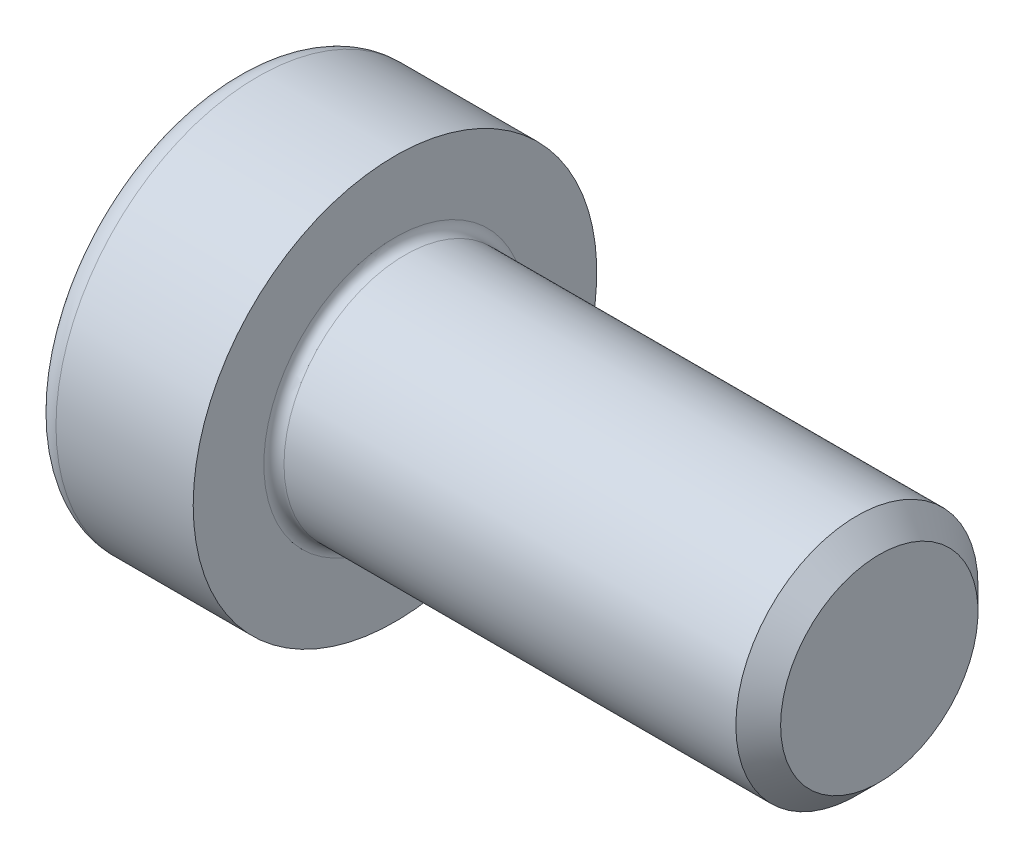
ISO-10303-21;
HEADER;
FILE_DESCRIPTION(('STEP AP214'),'2;1');
FILE_NAME('part.step','',(''),(''),'','','');
FILE_SCHEMA(('AUTOMOTIVE_DESIGN { 1 0 10303 214 1 1 1 1 }'));
ENDSEC;
DATA;
#1=APPLICATION_CONTEXT('core data for automotive mechanical design processes');
#2=APPLICATION_PROTOCOL_DEFINITION('international standard','automotive_design',2000,#1);
#3=PRODUCT_CONTEXT('',#1,'mechanical');
#4=PRODUCT('Part','Part','',(#3));
#5=PRODUCT_RELATED_PRODUCT_CATEGORY('part','',(#4));
#6=PRODUCT_DEFINITION_FORMATION('','',#4);
#7=PRODUCT_DEFINITION_CONTEXT('part definition',#1,'design');
#8=PRODUCT_DEFINITION('design','',#6,#7);
#9=PRODUCT_DEFINITION_SHAPE('','',#8);
#10=(LENGTH_UNIT() NAMED_UNIT(*) SI_UNIT(.MILLI.,.METRE.));
#11=(NAMED_UNIT(*) PLANE_ANGLE_UNIT() SI_UNIT($,.RADIAN.));
#12=(NAMED_UNIT(*) SI_UNIT($,.STERADIAN.) SOLID_ANGLE_UNIT());
#13=UNCERTAINTY_MEASURE_WITH_UNIT(LENGTH_MEASURE(1.E-05),#10,'distance_accuracy_value','');
#14=(GEOMETRIC_REPRESENTATION_CONTEXT(3) GLOBAL_UNCERTAINTY_ASSIGNED_CONTEXT((#13)) GLOBAL_UNIT_ASSIGNED_CONTEXT((#10,
#11,#12)) REPRESENTATION_CONTEXT('',''));
#15=CARTESIAN_POINT('',(0.,0.,0.));
#16=DIRECTION('',(0.,0.,1.));
#17=DIRECTION('',(1.,0.,0.));
#18=AXIS2_PLACEMENT_3D('',#15,#16,#17);
#19=CARTESIAN_POINT('',(0.,0.,0.));
#20=DIRECTION('',(-1.,0.,0.));
#21=DIRECTION('',(0.,0.,1.));
#22=AXIS2_PLACEMENT_3D('',#19,#20,#21);
#23=PLANE('',#22);
#24=DIRECTION('',(0.,-0.499999999999998,0.86602540378444));
#25=VECTOR('',#24,1.);
#26=CARTESIAN_POINT('',(0.,2.30940107675851,0.));
#27=LINE('',#26,#25);
#28=CARTESIAN_POINT('',(0.,2.30940107675851,0.));
#29=VERTEX_POINT('',#28);
#30=CARTESIAN_POINT('',(0.,1.15470053837926,1.99999999999999));
#31=VERTEX_POINT('',#30);
#32=EDGE_CURVE('E266',#29,#31,#27,.T.);
#33=ORIENTED_EDGE('',*,*,#32,.T.);
#34=DIRECTION('',(0.,1.,0.));
#35=VECTOR('',#34,1.);
#36=CARTESIAN_POINT('',(0.,-1.15470053837924,2.));
#37=LINE('',#36,#35);
#38=CARTESIAN_POINT('',(0.,-1.15470053837924,2.));
#39=VERTEX_POINT('',#38);
#40=EDGE_CURVE('E138',#39,#31,#37,.T.);
#41=ORIENTED_EDGE('',*,*,#40,.F.);
#42=DIRECTION('',(0.,-0.500000000000001,-0.866025403784438));
#43=VECTOR('',#42,1.);
#44=CARTESIAN_POINT('',(0.,-1.15470053837924,2.));
#45=LINE('',#44,#43);
#46=CARTESIAN_POINT('',(0.,-2.30940107675849,0.));
#47=VERTEX_POINT('',#46);
#48=EDGE_CURVE('E269',#39,#47,#45,.T.);
#49=ORIENTED_EDGE('',*,*,#48,.T.);
#50=DIRECTION('',(0.,0.499999999999997,-0.86602540378444));
#51=VECTOR('',#50,1.);
#52=CARTESIAN_POINT('',(0.,-2.30940107675849,0.));
#53=LINE('',#52,#51);
#54=CARTESIAN_POINT('',(0.,-1.15470053837925,-2.));
#55=VERTEX_POINT('',#54);
#56=EDGE_CURVE('E272',#47,#55,#53,.T.);
#57=ORIENTED_EDGE('',*,*,#56,.T.);
#58=DIRECTION('',(0.,-1.,0.));
#59=VECTOR('',#58,1.);
#60=CARTESIAN_POINT('',(0.,1.15470053837925,-2.00000000000001));
#61=LINE('',#60,#59);
#62=CARTESIAN_POINT('',(0.,1.15470053837925,-2.00000000000001));
#63=VERTEX_POINT('',#62);
#64=EDGE_CURVE('E275',#63,#55,#61,.T.);
#65=ORIENTED_EDGE('',*,*,#64,.F.);
#66=DIRECTION('',(0.,-0.500000000000001,-0.866025403784438));
#67=VECTOR('',#66,1.);
#68=CARTESIAN_POINT('',(0.,2.30940107675851,0.));
#69=LINE('',#68,#67);
#70=EDGE_CURVE('E133',#29,#63,#69,.T.);
#71=ORIENTED_EDGE('',*,*,#70,.F.);
#72=EDGE_LOOP('',(#33,#41,#49,#57,#65,#71));
#73=FACE_BOUND('',#72,.T.);
#74=CARTESIAN_POINT('',(0.,0.,0.));
#75=DIRECTION('',(-1.,0.,0.));
#76=DIRECTION('',(0.,0.,1.));
#77=AXIS2_PLACEMENT_3D('',#74,#75,#76);
#78=CIRCLE('',#77,4.4);
#79=CARTESIAN_POINT('',(0.,0.,4.4));
#80=VERTEX_POINT('',#79);
#81=EDGE_CURVE('E50',#80,#80,#78,.T.);
#82=ORIENTED_EDGE('',*,*,#81,.T.);
#83=EDGE_LOOP('',(#82));
#84=FACE_BOUND('',#83,.T.);
#85=ADVANCED_FACE('F42',(#73,#84),#23,.T.);
#86=CARTESIAN_POINT('',(-31.75,0.,0.));
#87=DIRECTION('',(-1.,0.,0.));
#88=DIRECTION('',(0.,0.,1.));
#89=AXIS2_PLACEMENT_3D('',#86,#87,#88);
#90=CYLINDRICAL_SURFACE('',#89,5.);
#91=CARTESIAN_POINT('',(0.600000000000003,0.,0.));
#92=DIRECTION('',(-1.,0.,0.));
#93=DIRECTION('',(0.,0.,1.));
#94=AXIS2_PLACEMENT_3D('',#91,#92,#93);
#95=CIRCLE('',#94,5.);
#96=CARTESIAN_POINT('',(0.600000000000003,0.,5.));
#97=VERTEX_POINT('',#96);
#98=EDGE_CURVE('E11',#97,#97,#95,.F.);
#99=ORIENTED_EDGE('',*,*,#98,.T.);
#100=EDGE_LOOP('',(#99));
#101=FACE_BOUND('',#100,.T.);
#102=CARTESIAN_POINT('',(4.,0.,0.));
#103=DIRECTION('',(-1.,0.,0.));
#104=DIRECTION('',(0.,0.,1.));
#105=AXIS2_PLACEMENT_3D('',#102,#103,#104);
#106=CIRCLE('',#105,5.);
#107=CARTESIAN_POINT('',(4.,0.,5.));
#108=VERTEX_POINT('',#107);
#109=EDGE_CURVE('E156',#108,#108,#106,.T.);
#110=ORIENTED_EDGE('',*,*,#109,.T.);
#111=EDGE_LOOP('',(#110));
#112=FACE_BOUND('',#111,.T.);
#113=ADVANCED_FACE('F181',(#101,#112),#90,.T.);
#114=CARTESIAN_POINT('',(4.,5.,0.));
#115=DIRECTION('',(1.,0.,0.));
#116=DIRECTION('',(0.,0.,-1.));
#117=AXIS2_PLACEMENT_3D('',#114,#115,#116);
#118=PLANE('',#117);
#119=CARTESIAN_POINT('',(4.,0.,0.));
#120=DIRECTION('',(1.,0.,0.));
#121=DIRECTION('',(0.,0.,-1.));
#122=AXIS2_PLACEMENT_3D('',#119,#120,#121);
#123=CIRCLE('',#122,3.25);
#124=CARTESIAN_POINT('',(4.,0.,-3.25));
#125=VERTEX_POINT('',#124);
#126=EDGE_CURVE('E159',#125,#125,#123,.F.);
#127=ORIENTED_EDGE('',*,*,#126,.T.);
#128=EDGE_LOOP('',(#127));
#129=FACE_BOUND('',#128,.T.);
#130=ORIENTED_EDGE('',*,*,#109,.F.);
#131=EDGE_LOOP('',(#130));
#132=FACE_BOUND('',#131,.T.);
#133=ADVANCED_FACE('F186',(#129,#132),#118,.T.);
#134=CARTESIAN_POINT('',(-31.75,0.,0.));
#135=DIRECTION('',(-1.,0.,0.));
#136=DIRECTION('',(0.,0.,1.));
#137=AXIS2_PLACEMENT_3D('',#134,#135,#136);
#138=CYLINDRICAL_SURFACE('',#137,3.);
#139=CARTESIAN_POINT('',(4.25,0.,0.));
#140=DIRECTION('',(1.,0.,0.));
#141=DIRECTION('',(0.,0.,-1.));
#142=AXIS2_PLACEMENT_3D('',#139,#140,#141);
#143=CIRCLE('',#142,3.);
#144=CARTESIAN_POINT('',(4.25,0.,-3.));
#145=VERTEX_POINT('',#144);
#146=EDGE_CURVE('E162',#145,#145,#143,.T.);
#147=ORIENTED_EDGE('',*,*,#146,.T.);
#148=EDGE_LOOP('',(#147));
#149=FACE_BOUND('',#148,.T.);
#150=CARTESIAN_POINT('',(15.4455,0.,0.));
#151=DIRECTION('',(-1.,0.,0.));
#152=DIRECTION('',(0.,0.,1.));
#153=AXIS2_PLACEMENT_3D('',#150,#151,#152);
#154=CIRCLE('',#153,3.);
#155=CARTESIAN_POINT('',(15.4455,0.,3.));
#156=VERTEX_POINT('',#155);
#157=EDGE_CURVE('E153',#156,#156,#154,.T.);
#158=ORIENTED_EDGE('',*,*,#157,.T.);
#159=EDGE_LOOP('',(#158));
#160=FACE_BOUND('',#159,.T.);
#161=ADVANCED_FACE('F192',(#149,#160),#138,.T.);
#162=CARTESIAN_POINT('',(16.,0.,0.));
#163=DIRECTION('',(-1.,0.,0.));
#164=DIRECTION('',(0.,0.,1.));
#165=AXIS2_PLACEMENT_3D('',#162,#163,#164);
#166=CONICAL_SURFACE('',#165,2.4455,0.785398163397455);
#167=ORIENTED_EDGE('',*,*,#157,.F.);
#168=EDGE_LOOP('',(#167));
#169=FACE_BOUND('',#168,.T.);
#170=CARTESIAN_POINT('',(16.,0.,0.));
#171=DIRECTION('',(-1.,0.,0.));
#172=DIRECTION('',(0.,0.,1.));
#173=AXIS2_PLACEMENT_3D('',#170,#171,#172);
#174=CIRCLE('',#173,2.4455);
#175=CARTESIAN_POINT('',(16.,0.,2.4455));
#176=VERTEX_POINT('',#175);
#177=EDGE_CURVE('E149',#176,#176,#174,.T.);
#178=ORIENTED_EDGE('',*,*,#177,.T.);
#179=EDGE_LOOP('',(#178));
#180=FACE_BOUND('',#179,.T.);
#181=ADVANCED_FACE('F196',(#169,#180),#166,.T.);
#182=CARTESIAN_POINT('',(16.,2.4455,0.));
#183=DIRECTION('',(1.,0.,0.));
#184=DIRECTION('',(0.,0.,-1.));
#185=AXIS2_PLACEMENT_3D('',#182,#183,#184);
#186=PLANE('',#185);
#187=ORIENTED_EDGE('',*,*,#177,.F.);
#188=EDGE_LOOP('',(#187));
#189=FACE_BOUND('',#188,.T.);
#190=ADVANCED_FACE('F178',(#189),#186,.T.);
#191=CARTESIAN_POINT('',(4.25,0.,0.));
#192=DIRECTION('',(1.,0.,0.));
#193=DIRECTION('',(0.,0.,-1.));
#194=AXIS2_PLACEMENT_3D('',#191,#192,#193);
#195=TOROIDAL_SURFACE('',#194,3.25,0.25);
#196=ORIENTED_EDGE('',*,*,#146,.F.);
#197=EDGE_LOOP('',(#196));
#198=FACE_BOUND('',#197,.T.);
#199=ORIENTED_EDGE('',*,*,#126,.F.);
#200=EDGE_LOOP('',(#199));
#201=FACE_BOUND('',#200,.T.);
#202=ADVANCED_FACE('F169',(#198,#201),#195,.F.);
#203=CARTESIAN_POINT('',(0.600000000000003,0.,0.));
#204=DIRECTION('',(-1.,0.,0.));
#205=DIRECTION('',(0.,0.,1.));
#206=AXIS2_PLACEMENT_3D('',#203,#204,#205);
#207=TOROIDAL_SURFACE('',#206,4.4,0.6);
#208=ORIENTED_EDGE('',*,*,#98,.F.);
#209=EDGE_LOOP('',(#208));
#210=FACE_BOUND('',#209,.T.);
#211=ORIENTED_EDGE('',*,*,#81,.F.);
#212=EDGE_LOOP('',(#211));
#213=FACE_BOUND('',#212,.T.);
#214=ADVANCED_FACE('F44',(#210,#213),#207,.T.);
#215=CARTESIAN_POINT('',(3.,2.30940107675851,0.));
#216=DIRECTION('',(0.,-0.86602540378444,-0.499999999999998));
#217=DIRECTION('',(0.,0.499999999999998,-0.86602540378444));
#218=AXIS2_PLACEMENT_3D('',#215,#216,#217);
#219=PLANE('',#218);
#220=ORIENTED_EDGE('',*,*,#32,.F.);
#221=DIRECTION('',(-1.,0.,0.));
#222=VECTOR('',#221,1.);
#223=CARTESIAN_POINT('',(3.,2.30940107675851,0.));
#224=LINE('',#223,#222);
#225=CARTESIAN_POINT('',(3.,2.30940107675851,0.));
#226=VERTEX_POINT('',#225);
#227=EDGE_CURVE('E256',#226,#29,#224,.T.);
#228=ORIENTED_EDGE('',*,*,#227,.F.);
#229=DIRECTION('',(0.,-0.499999999999998,0.86602540378444));
#230=VECTOR('',#229,1.);
#231=CARTESIAN_POINT('',(3.,2.30940107675851,0.));
#232=LINE('',#231,#230);
#233=CARTESIAN_POINT('',(3.,1.73205080756888,0.999999999999997));
#234=VERTEX_POINT('',#233);
#235=EDGE_CURVE('E125',#226,#234,#232,.T.);
#236=ORIENTED_EDGE('',*,*,#235,.T.);
#237=CARTESIAN_POINT('',(3.,1.15470053837926,1.99999999999999));
#238=VERTEX_POINT('',#237);
#239=EDGE_CURVE('E116',#234,#238,#232,.T.);
#240=ORIENTED_EDGE('',*,*,#239,.T.);
#241=DIRECTION('',(-1.,0.,0.));
#242=VECTOR('',#241,1.);
#243=CARTESIAN_POINT('',(3.,1.15470053837926,1.99999999999999));
#244=LINE('',#243,#242);
#245=EDGE_CURVE('E130',#238,#31,#244,.T.);
#246=ORIENTED_EDGE('',*,*,#245,.T.);
#247=EDGE_LOOP('',(#220,#228,#236,#240,#246));
#248=FACE_BOUND('',#247,.T.);
#249=ADVANCED_FACE('F129',(#248),#219,.T.);
#250=CARTESIAN_POINT('',(3.,-1.15470053837924,2.));
#251=DIRECTION('',(0.,0.,1.));
#252=DIRECTION('',(0.,-1.,0.));
#253=AXIS2_PLACEMENT_3D('',#250,#251,#252);
#254=PLANE('',#253);
#255=ORIENTED_EDGE('',*,*,#40,.T.);
#256=ORIENTED_EDGE('',*,*,#245,.F.);
#257=DIRECTION('',(0.,1.,0.));
#258=VECTOR('',#257,1.);
#259=CARTESIAN_POINT('',(3.,-1.15470053837924,2.));
#260=LINE('',#259,#258);
#261=CARTESIAN_POINT('',(3.,0.,1.99999999999999));
#262=VERTEX_POINT('',#261);
#263=EDGE_CURVE('E113',#262,#238,#260,.T.);
#264=ORIENTED_EDGE('',*,*,#263,.F.);
#265=CARTESIAN_POINT('',(3.,-1.15470053837924,2.));
#266=VERTEX_POINT('',#265);
#267=EDGE_CURVE('E124',#266,#262,#260,.T.);
#268=ORIENTED_EDGE('',*,*,#267,.F.);
#269=DIRECTION('',(-1.,0.,0.));
#270=VECTOR('',#269,1.);
#271=CARTESIAN_POINT('',(3.,-1.15470053837924,2.));
#272=LINE('',#271,#270);
#273=EDGE_CURVE('E140',#266,#39,#272,.T.);
#274=ORIENTED_EDGE('',*,*,#273,.T.);
#275=EDGE_LOOP('',(#255,#256,#264,#268,#274));
#276=FACE_BOUND('',#275,.T.);
#277=ADVANCED_FACE('F135',(#276),#254,.F.);
#278=CARTESIAN_POINT('',(3.,-1.15470053837924,2.));
#279=DIRECTION('',(0.,0.866025403784438,-0.500000000000001));
#280=DIRECTION('',(0.,0.500000000000001,0.866025403784438));
#281=AXIS2_PLACEMENT_3D('',#278,#279,#280);
#282=PLANE('',#281);
#283=ORIENTED_EDGE('',*,*,#48,.F.);
#284=ORIENTED_EDGE('',*,*,#273,.F.);
#285=DIRECTION('',(0.,-0.500000000000001,-0.866025403784438));
#286=VECTOR('',#285,1.);
#287=CARTESIAN_POINT('',(3.,-1.15470053837924,2.));
#288=LINE('',#287,#286);
#289=CARTESIAN_POINT('',(3.,-1.73205080756887,0.999999999999997));
#290=VERTEX_POINT('',#289);
#291=EDGE_CURVE('E295',#266,#290,#288,.T.);
#292=ORIENTED_EDGE('',*,*,#291,.T.);
#293=CARTESIAN_POINT('',(3.,-2.30940107675849,0.));
#294=VERTEX_POINT('',#293);
#295=EDGE_CURVE('E284',#290,#294,#288,.T.);
#296=ORIENTED_EDGE('',*,*,#295,.T.);
#297=DIRECTION('',(-1.,0.,0.));
#298=VECTOR('',#297,1.);
#299=CARTESIAN_POINT('',(3.,-2.30940107675849,0.));
#300=LINE('',#299,#298);
#301=EDGE_CURVE('E145',#294,#47,#300,.T.);
#302=ORIENTED_EDGE('',*,*,#301,.T.);
#303=EDGE_LOOP('',(#283,#284,#292,#296,#302));
#304=FACE_BOUND('',#303,.T.);
#305=ADVANCED_FACE('F210',(#304),#282,.T.);
#306=CARTESIAN_POINT('',(3.,-2.30940107675849,0.));
#307=DIRECTION('',(0.,0.86602540378444,0.499999999999998));
#308=DIRECTION('',(0.,-0.499999999999998,0.86602540378444));
#309=AXIS2_PLACEMENT_3D('',#306,#307,#308);
#310=PLANE('',#309);
#311=ORIENTED_EDGE('',*,*,#56,.F.);
#312=ORIENTED_EDGE('',*,*,#301,.F.);
#313=DIRECTION('',(0.,0.499999999999997,-0.86602540378444));
#314=VECTOR('',#313,1.);
#315=CARTESIAN_POINT('',(3.,-2.30940107675849,0.));
#316=LINE('',#315,#314);
#317=CARTESIAN_POINT('',(3.,-1.73205080756888,-0.999999999999993));
#318=VERTEX_POINT('',#317);
#319=EDGE_CURVE('E262',#294,#318,#316,.T.);
#320=ORIENTED_EDGE('',*,*,#319,.T.);
#321=CARTESIAN_POINT('',(3.,-1.15470053837925,-2.));
#322=VERTEX_POINT('',#321);
#323=EDGE_CURVE('E294',#318,#322,#316,.T.);
#324=ORIENTED_EDGE('',*,*,#323,.T.);
#325=DIRECTION('',(-1.,0.,0.));
#326=VECTOR('',#325,1.);
#327=CARTESIAN_POINT('',(3.,-1.15470053837925,-2.));
#328=LINE('',#327,#326);
#329=EDGE_CURVE('E255',#322,#55,#328,.T.);
#330=ORIENTED_EDGE('',*,*,#329,.T.);
#331=EDGE_LOOP('',(#311,#312,#320,#324,#330));
#332=FACE_BOUND('',#331,.T.);
#333=ADVANCED_FACE('F213',(#332),#310,.T.);
#334=CARTESIAN_POINT('',(3.,1.15470053837925,-2.00000000000001));
#335=DIRECTION('',(0.,0.,-1.));
#336=DIRECTION('',(0.,1.,0.));
#337=AXIS2_PLACEMENT_3D('',#334,#335,#336);
#338=PLANE('',#337);
#339=ORIENTED_EDGE('',*,*,#64,.T.);
#340=ORIENTED_EDGE('',*,*,#329,.F.);
#341=DIRECTION('',(0.,-1.,0.));
#342=VECTOR('',#341,1.);
#343=CARTESIAN_POINT('',(3.,1.15470053837925,-2.00000000000001));
#344=LINE('',#343,#342);
#345=CARTESIAN_POINT('',(3.,0.,-2.));
#346=VERTEX_POINT('',#345);
#347=EDGE_CURVE('E259',#346,#322,#344,.T.);
#348=ORIENTED_EDGE('',*,*,#347,.F.);
#349=CARTESIAN_POINT('',(3.,1.15470053837925,-2.00000000000001));
#350=VERTEX_POINT('',#349);
#351=EDGE_CURVE('E57',#350,#346,#344,.T.);
#352=ORIENTED_EDGE('',*,*,#351,.F.);
#353=DIRECTION('',(-1.,0.,0.));
#354=VECTOR('',#353,1.);
#355=CARTESIAN_POINT('',(3.,1.15470053837925,-2.00000000000001));
#356=LINE('',#355,#354);
#357=EDGE_CURVE('E252',#350,#63,#356,.T.);
#358=ORIENTED_EDGE('',*,*,#357,.T.);
#359=EDGE_LOOP('',(#339,#340,#348,#352,#358));
#360=FACE_BOUND('',#359,.T.);
#361=ADVANCED_FACE('F217',(#360),#338,.F.);
#362=CARTESIAN_POINT('',(3.,2.30940107675851,0.));
#363=DIRECTION('',(0.,0.866025403784438,-0.500000000000001));
#364=DIRECTION('',(0.,0.500000000000001,0.866025403784438));
#365=AXIS2_PLACEMENT_3D('',#362,#363,#364);
#366=PLANE('',#365);
#367=ORIENTED_EDGE('',*,*,#70,.T.);
#368=ORIENTED_EDGE('',*,*,#357,.F.);
#369=DIRECTION('',(0.,-0.500000000000001,-0.866025403784438));
#370=VECTOR('',#369,1.);
#371=CARTESIAN_POINT('',(3.,2.30940107675851,0.));
#372=LINE('',#371,#370);
#373=CARTESIAN_POINT('',(3.,1.73205080756888,-1.00000000000001));
#374=VERTEX_POINT('',#373);
#375=EDGE_CURVE('E242',#374,#350,#372,.T.);
#376=ORIENTED_EDGE('',*,*,#375,.F.);
#377=EDGE_CURVE('E248',#226,#374,#372,.T.);
#378=ORIENTED_EDGE('',*,*,#377,.F.);
#379=ORIENTED_EDGE('',*,*,#227,.T.);
#380=EDGE_LOOP('',(#367,#368,#376,#378,#379));
#381=FACE_BOUND('',#380,.T.);
#382=ADVANCED_FACE('F221',(#381),#366,.F.);
#383=CARTESIAN_POINT('',(3.,3.46410161513775,-2.00000000000001));
#384=DIRECTION('',(1.,0.,0.));
#385=DIRECTION('',(0.,0.,-1.));
#386=AXIS2_PLACEMENT_3D('',#383,#384,#385);
#387=PLANE('',#386);
#388=ORIENTED_EDGE('',*,*,#347,.T.);
#389=ORIENTED_EDGE('',*,*,#323,.F.);
#390=CARTESIAN_POINT('',(3.,0.,0.));
#391=DIRECTION('',(-1.,0.,0.));
#392=DIRECTION('',(0.,0.,1.));
#393=AXIS2_PLACEMENT_3D('',#390,#391,#392);
#394=CIRCLE('',#393,2.);
#395=EDGE_CURVE('E290',#346,#318,#394,.T.);
#396=ORIENTED_EDGE('',*,*,#395,.F.);
#397=EDGE_LOOP('',(#388,#389,#396));
#398=FACE_BOUND('',#397,.T.);
#399=ADVANCED_FACE('F225',(#398),#387,.F.);
#400=ORIENTED_EDGE('',*,*,#319,.F.);
#401=ORIENTED_EDGE('',*,*,#295,.F.);
#402=EDGE_CURVE('E143',#318,#290,#394,.T.);
#403=ORIENTED_EDGE('',*,*,#402,.F.);
#404=EDGE_LOOP('',(#400,#401,#403));
#405=FACE_BOUND('',#404,.T.);
#406=ADVANCED_FACE('F228',(#405),#387,.F.);
#407=ORIENTED_EDGE('',*,*,#291,.F.);
#408=ORIENTED_EDGE('',*,*,#267,.T.);
#409=EDGE_CURVE('E139',#290,#262,#394,.T.);
#410=ORIENTED_EDGE('',*,*,#409,.F.);
#411=EDGE_LOOP('',(#407,#408,#410));
#412=FACE_BOUND('',#411,.T.);
#413=ADVANCED_FACE('F233',(#412),#387,.F.);
#414=ORIENTED_EDGE('',*,*,#263,.T.);
#415=ORIENTED_EDGE('',*,*,#239,.F.);
#416=EDGE_CURVE('E119',#262,#234,#394,.T.);
#417=ORIENTED_EDGE('',*,*,#416,.F.);
#418=EDGE_LOOP('',(#414,#415,#417));
#419=FACE_BOUND('',#418,.T.);
#420=ADVANCED_FACE('F115',(#419),#387,.F.);
#421=ORIENTED_EDGE('',*,*,#235,.F.);
#422=ORIENTED_EDGE('',*,*,#377,.T.);
#423=EDGE_CURVE('E150',#234,#374,#394,.T.);
#424=ORIENTED_EDGE('',*,*,#423,.F.);
#425=EDGE_LOOP('',(#421,#422,#424));
#426=FACE_BOUND('',#425,.T.);
#427=ADVANCED_FACE('F236',(#426),#387,.F.);
#428=ORIENTED_EDGE('',*,*,#375,.T.);
#429=ORIENTED_EDGE('',*,*,#351,.T.);
#430=EDGE_CURVE('E245',#374,#346,#394,.T.);
#431=ORIENTED_EDGE('',*,*,#430,.F.);
#432=EDGE_LOOP('',(#428,#429,#431));
#433=FACE_BOUND('',#432,.T.);
#434=ADVANCED_FACE('F206',(#433),#387,.F.);
#435=CARTESIAN_POINT('',(3.,0.,0.));
#436=DIRECTION('',(-1.,0.,0.));
#437=DIRECTION('',(0.,0.,1.));
#438=AXIS2_PLACEMENT_3D('',#435,#436,#437);
#439=CONICAL_SURFACE('',#438,2.,1.04719755119659);
#440=CARTESIAN_POINT('',(4.15470053837927,0.,0.));
#441=VERTEX_POINT('',#440);
#442=VERTEX_LOOP('',#441);
#443=FACE_BOUND('',#442,.T.);
#444=ORIENTED_EDGE('',*,*,#416,.T.);
#445=ORIENTED_EDGE('',*,*,#423,.T.);
#446=ORIENTED_EDGE('',*,*,#430,.T.);
#447=ORIENTED_EDGE('',*,*,#395,.T.);
#448=ORIENTED_EDGE('',*,*,#402,.T.);
#449=ORIENTED_EDGE('',*,*,#409,.T.);
#450=EDGE_LOOP('',(#444,#445,#446,#447,#448,#449));
#451=FACE_BOUND('',#450,.T.);
#452=ADVANCED_FACE('F204',(#443,#451),#439,.F.);
#453=CLOSED_SHELL('',(#85,#113,#133,#161,#181,#190,#202,#214,#249,#277,#305,#333,#361,#382,#399,
#406,#413,#420,#427,#434,#452));
#454=MANIFOLD_SOLID_BREP('B2',#453);
#455=ADVANCED_BREP_SHAPE_REPRESENTATION('',(#18,#454),#14);
#456=SHAPE_DEFINITION_REPRESENTATION(#9,#455);
ENDSEC;
END-ISO-10303-21;
